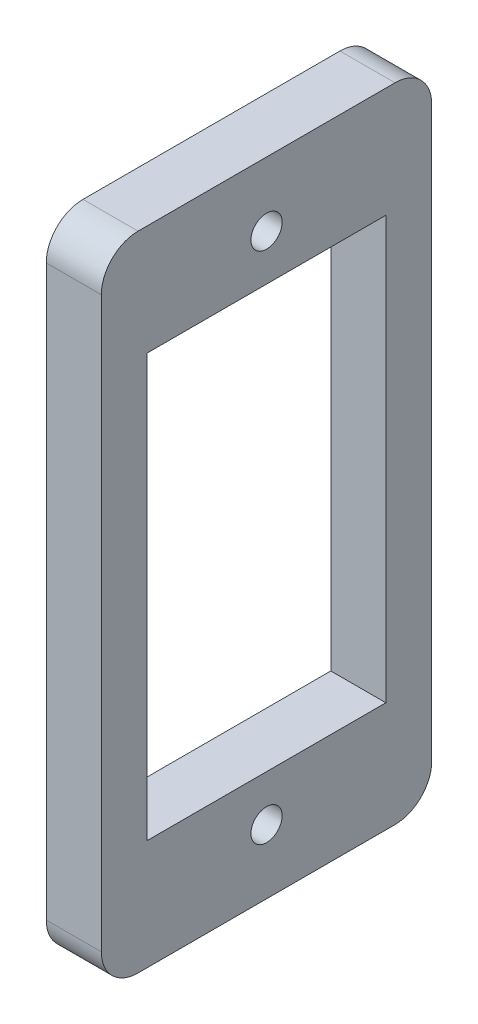
ISO-10303-21;
HEADER;
FILE_DESCRIPTION(('STEP AP214'),'2;1');
FILE_NAME('part.step','',(''),(''),'','','');
FILE_SCHEMA(('AUTOMOTIVE_DESIGN { 1 0 10303 214 1 1 1 1 }'));
ENDSEC;
DATA;
#1=APPLICATION_CONTEXT('core data for automotive mechanical design processes');
#2=APPLICATION_PROTOCOL_DEFINITION('international standard','automotive_design',2000,#1);
#3=PRODUCT_CONTEXT('',#1,'mechanical');
#4=PRODUCT('Part','Part','',(#3));
#5=PRODUCT_RELATED_PRODUCT_CATEGORY('part','',(#4));
#6=PRODUCT_DEFINITION_FORMATION('','',#4);
#7=PRODUCT_DEFINITION_CONTEXT('part definition',#1,'design');
#8=PRODUCT_DEFINITION('design','',#6,#7);
#9=PRODUCT_DEFINITION_SHAPE('','',#8);
#10=(LENGTH_UNIT() NAMED_UNIT(*) SI_UNIT(.MILLI.,.METRE.));
#11=(NAMED_UNIT(*) PLANE_ANGLE_UNIT() SI_UNIT($,.RADIAN.));
#12=(NAMED_UNIT(*) SI_UNIT($,.STERADIAN.) SOLID_ANGLE_UNIT());
#13=UNCERTAINTY_MEASURE_WITH_UNIT(LENGTH_MEASURE(1.E-05),#10,'distance_accuracy_value','');
#14=(GEOMETRIC_REPRESENTATION_CONTEXT(3) GLOBAL_UNCERTAINTY_ASSIGNED_CONTEXT((#13)) GLOBAL_UNIT_ASSIGNED_CONTEXT((#10,
#11,#12)) REPRESENTATION_CONTEXT('',''));
#15=CARTESIAN_POINT('',(0.,0.,0.));
#16=DIRECTION('',(0.,0.,1.));
#17=DIRECTION('',(1.,0.,0.));
#18=AXIS2_PLACEMENT_3D('',#15,#16,#17);
#19=CARTESIAN_POINT('',(3.,-17.5,-9.));
#20=DIRECTION('',(0.,0.,1.));
#21=DIRECTION('',(1.,0.,0.));
#22=AXIS2_PLACEMENT_3D('',#19,#20,#21);
#23=PLANE('',#22);
#24=DIRECTION('',(0.,1.,0.));
#25=VECTOR('',#24,1.);
#26=CARTESIAN_POINT('',(3.,-17.5,-9.));
#27=LINE('',#26,#25);
#28=CARTESIAN_POINT('',(3.,-15.5,-9.));
#29=VERTEX_POINT('',#28);
#30=CARTESIAN_POINT('',(3.,15.5,-9.));
#31=VERTEX_POINT('',#30);
#32=EDGE_CURVE('E165',#29,#31,#27,.T.);
#33=ORIENTED_EDGE('',*,*,#32,.F.);
#34=DIRECTION('',(-1.,0.,0.));
#35=VECTOR('',#34,1.);
#36=CARTESIAN_POINT('',(3.,-15.5,-9.));
#37=LINE('',#36,#35);
#38=CARTESIAN_POINT('',(0.,-15.5,-9.));
#39=VERTEX_POINT('',#38);
#40=EDGE_CURVE('E212',#29,#39,#37,.T.);
#41=ORIENTED_EDGE('',*,*,#40,.T.);
#42=DIRECTION('',(0.,1.,0.));
#43=VECTOR('',#42,1.);
#44=CARTESIAN_POINT('',(0.,-17.5,-9.));
#45=LINE('',#44,#43);
#46=CARTESIAN_POINT('',(0.,15.5,-9.));
#47=VERTEX_POINT('',#46);
#48=EDGE_CURVE('E133',#39,#47,#45,.T.);
#49=ORIENTED_EDGE('',*,*,#48,.T.);
#50=DIRECTION('',(-1.,0.,0.));
#51=VECTOR('',#50,1.);
#52=CARTESIAN_POINT('',(3.,15.5,-9.));
#53=LINE('',#52,#51);
#54=EDGE_CURVE('E210',#47,#31,#53,.F.);
#55=ORIENTED_EDGE('',*,*,#54,.T.);
#56=EDGE_LOOP('',(#33,#41,#49,#55));
#57=FACE_BOUND('',#56,.T.);
#58=ADVANCED_FACE('F33',(#57),#23,.F.);
#59=CARTESIAN_POINT('',(3.,17.5,9.));
#60=DIRECTION('',(0.,-1.,0.));
#61=DIRECTION('',(0.,0.,-1.));
#62=AXIS2_PLACEMENT_3D('',#59,#60,#61);
#63=PLANE('',#62);
#64=DIRECTION('',(0.,0.,1.));
#65=VECTOR('',#64,1.);
#66=CARTESIAN_POINT('',(0.,17.5,9.));
#67=LINE('',#66,#65);
#68=CARTESIAN_POINT('',(0.,17.5,-7.));
#69=VERTEX_POINT('',#68);
#70=CARTESIAN_POINT('',(0.,17.5,7.));
#71=VERTEX_POINT('',#70);
#72=EDGE_CURVE('E179',#69,#71,#67,.T.);
#73=ORIENTED_EDGE('',*,*,#72,.T.);
#74=DIRECTION('',(-1.,0.,0.));
#75=VECTOR('',#74,1.);
#76=CARTESIAN_POINT('',(3.,17.5,7.));
#77=LINE('',#76,#75);
#78=CARTESIAN_POINT('',(3.,17.5,7.));
#79=VERTEX_POINT('',#78);
#80=EDGE_CURVE('E11',#71,#79,#77,.F.);
#81=ORIENTED_EDGE('',*,*,#80,.T.);
#82=DIRECTION('',(0.,0.,1.));
#83=VECTOR('',#82,1.);
#84=CARTESIAN_POINT('',(3.,17.5,9.));
#85=LINE('',#84,#83);
#86=CARTESIAN_POINT('',(3.,17.5,-7.));
#87=VERTEX_POINT('',#86);
#88=EDGE_CURVE('E167',#87,#79,#85,.T.);
#89=ORIENTED_EDGE('',*,*,#88,.F.);
#90=DIRECTION('',(-1.,0.,0.));
#91=VECTOR('',#90,1.);
#92=CARTESIAN_POINT('',(3.,17.5,-7.));
#93=LINE('',#92,#91);
#94=EDGE_CURVE('E41',#87,#69,#93,.T.);
#95=ORIENTED_EDGE('',*,*,#94,.T.);
#96=EDGE_LOOP('',(#73,#81,#89,#95));
#97=FACE_BOUND('',#96,.T.);
#98=ADVANCED_FACE('F217',(#97),#63,.F.);
#99=CARTESIAN_POINT('',(3.,-17.5,9.));
#100=DIRECTION('',(0.,0.,-1.));
#101=DIRECTION('',(-1.,0.,0.));
#102=AXIS2_PLACEMENT_3D('',#99,#100,#101);
#103=PLANE('',#102);
#104=DIRECTION('',(0.,-1.,0.));
#105=VECTOR('',#104,1.);
#106=CARTESIAN_POINT('',(0.,-17.5,9.));
#107=LINE('',#106,#105);
#108=CARTESIAN_POINT('',(0.,15.5,9.));
#109=VERTEX_POINT('',#108);
#110=CARTESIAN_POINT('',(0.,-15.5,9.));
#111=VERTEX_POINT('',#110);
#112=EDGE_CURVE('E181',#109,#111,#107,.T.);
#113=ORIENTED_EDGE('',*,*,#112,.T.);
#114=DIRECTION('',(-1.,0.,0.));
#115=VECTOR('',#114,1.);
#116=CARTESIAN_POINT('',(3.,-15.5,9.));
#117=LINE('',#116,#115);
#118=CARTESIAN_POINT('',(3.,-15.5,9.));
#119=VERTEX_POINT('',#118);
#120=EDGE_CURVE('E201',#111,#119,#117,.F.);
#121=ORIENTED_EDGE('',*,*,#120,.T.);
#122=DIRECTION('',(0.,-1.,0.));
#123=VECTOR('',#122,1.);
#124=CARTESIAN_POINT('',(3.,-17.5,9.));
#125=LINE('',#124,#123);
#126=CARTESIAN_POINT('',(3.,15.5,9.));
#127=VERTEX_POINT('',#126);
#128=EDGE_CURVE('E170',#127,#119,#125,.T.);
#129=ORIENTED_EDGE('',*,*,#128,.F.);
#130=DIRECTION('',(-1.,0.,0.));
#131=VECTOR('',#130,1.);
#132=CARTESIAN_POINT('',(3.,15.5,9.));
#133=LINE('',#132,#131);
#134=EDGE_CURVE('E198',#127,#109,#133,.T.);
#135=ORIENTED_EDGE('',*,*,#134,.T.);
#136=EDGE_LOOP('',(#113,#121,#129,#135));
#137=FACE_BOUND('',#136,.T.);
#138=ADVANCED_FACE('F228',(#137),#103,.F.);
#139=CARTESIAN_POINT('',(3.,-17.5,9.));
#140=DIRECTION('',(0.,1.,0.));
#141=DIRECTION('',(0.,0.,1.));
#142=AXIS2_PLACEMENT_3D('',#139,#140,#141);
#143=PLANE('',#142);
#144=DIRECTION('',(0.,0.,-1.));
#145=VECTOR('',#144,1.);
#146=CARTESIAN_POINT('',(3.,-17.5,9.));
#147=LINE('',#146,#145);
#148=CARTESIAN_POINT('',(3.,-17.5,7.));
#149=VERTEX_POINT('',#148);
#150=CARTESIAN_POINT('',(3.,-17.5,-7.));
#151=VERTEX_POINT('',#150);
#152=EDGE_CURVE('E173',#149,#151,#147,.T.);
#153=ORIENTED_EDGE('',*,*,#152,.F.);
#154=DIRECTION('',(-1.,0.,0.));
#155=VECTOR('',#154,1.);
#156=CARTESIAN_POINT('',(3.,-17.5,7.));
#157=LINE('',#156,#155);
#158=CARTESIAN_POINT('',(0.,-17.5,7.));
#159=VERTEX_POINT('',#158);
#160=EDGE_CURVE('E187',#149,#159,#157,.T.);
#161=ORIENTED_EDGE('',*,*,#160,.T.);
#162=DIRECTION('',(0.,0.,-1.));
#163=VECTOR('',#162,1.);
#164=CARTESIAN_POINT('',(0.,-17.5,9.));
#165=LINE('',#164,#163);
#166=CARTESIAN_POINT('',(0.,-17.5,-7.));
#167=VERTEX_POINT('',#166);
#168=EDGE_CURVE('E168',#159,#167,#165,.T.);
#169=ORIENTED_EDGE('',*,*,#168,.T.);
#170=DIRECTION('',(-1.,0.,0.));
#171=VECTOR('',#170,1.);
#172=CARTESIAN_POINT('',(3.,-17.5,-7.));
#173=LINE('',#172,#171);
#174=EDGE_CURVE('E176',#167,#151,#173,.F.);
#175=ORIENTED_EDGE('',*,*,#174,.T.);
#176=EDGE_LOOP('',(#153,#161,#169,#175));
#177=FACE_BOUND('',#176,.T.);
#178=ADVANCED_FACE('F237',(#177),#143,.F.);
#179=CARTESIAN_POINT('',(3.,0.,0.));
#180=DIRECTION('',(-1.,0.,0.));
#181=DIRECTION('',(0.,0.,1.));
#182=AXIS2_PLACEMENT_3D('',#179,#180,#181);
#183=PLANE('',#182);
#184=CARTESIAN_POINT('',(3.,-14.,0.));
#185=DIRECTION('',(-1.,0.,0.));
#186=DIRECTION('',(0.,0.,1.));
#187=AXIS2_PLACEMENT_3D('',#184,#185,#186);
#188=CIRCLE('',#187,0.85);
#189=CARTESIAN_POINT('',(3.,-14.,0.85));
#190=VERTEX_POINT('',#189);
#191=EDGE_CURVE('E385',#190,#190,#188,.F.);
#192=ORIENTED_EDGE('',*,*,#191,.F.);
#193=EDGE_LOOP('',(#192));
#194=FACE_BOUND('',#193,.T.);
#195=CARTESIAN_POINT('',(3.,14.,0.));
#196=DIRECTION('',(-1.,0.,0.));
#197=DIRECTION('',(0.,0.,1.));
#198=AXIS2_PLACEMENT_3D('',#195,#196,#197);
#199=CIRCLE('',#198,0.85);
#200=CARTESIAN_POINT('',(3.,14.,0.85));
#201=VERTEX_POINT('',#200);
#202=EDGE_CURVE('E389',#201,#201,#199,.F.);
#203=ORIENTED_EDGE('',*,*,#202,.F.);
#204=EDGE_LOOP('',(#203));
#205=FACE_BOUND('',#204,.T.);
#206=DIRECTION('',(0.,0.,-1.));
#207=VECTOR('',#206,1.);
#208=CARTESIAN_POINT('',(3.,-11.5,-6.5));
#209=LINE('',#208,#207);
#210=CARTESIAN_POINT('',(3.,-11.5,6.5));
#211=VERTEX_POINT('',#210);
#212=CARTESIAN_POINT('',(3.,-11.5,-6.5));
#213=VERTEX_POINT('',#212);
#214=EDGE_CURVE('E149',#211,#213,#209,.T.);
#215=ORIENTED_EDGE('',*,*,#214,.F.);
#216=DIRECTION('',(0.,-1.,0.));
#217=VECTOR('',#216,1.);
#218=CARTESIAN_POINT('',(3.,-11.5,6.5));
#219=LINE('',#218,#217);
#220=CARTESIAN_POINT('',(3.,11.5,6.5));
#221=VERTEX_POINT('',#220);
#222=EDGE_CURVE('E141',#221,#211,#219,.T.);
#223=ORIENTED_EDGE('',*,*,#222,.F.);
#224=DIRECTION('',(0.,0.,1.));
#225=VECTOR('',#224,1.);
#226=CARTESIAN_POINT('',(3.,11.5,-6.5));
#227=LINE('',#226,#225);
#228=CARTESIAN_POINT('',(3.,11.5,-6.5));
#229=VERTEX_POINT('',#228);
#230=EDGE_CURVE('E142',#229,#221,#227,.T.);
#231=ORIENTED_EDGE('',*,*,#230,.F.);
#232=DIRECTION('',(0.,1.,0.));
#233=VECTOR('',#232,1.);
#234=CARTESIAN_POINT('',(3.,-11.5,-6.5));
#235=LINE('',#234,#233);
#236=EDGE_CURVE('E156',#213,#229,#235,.T.);
#237=ORIENTED_EDGE('',*,*,#236,.F.);
#238=EDGE_LOOP('',(#215,#223,#231,#237));
#239=FACE_BOUND('',#238,.T.);
#240=ORIENTED_EDGE('',*,*,#128,.T.);
#241=CARTESIAN_POINT('',(3.,-15.5,7.));
#242=DIRECTION('',(-1.,0.,0.));
#243=DIRECTION('',(0.,0.,1.));
#244=AXIS2_PLACEMENT_3D('',#241,#242,#243);
#245=CIRCLE('',#244,2.);
#246=EDGE_CURVE('E208',#119,#149,#245,.F.);
#247=ORIENTED_EDGE('',*,*,#246,.T.);
#248=ORIENTED_EDGE('',*,*,#152,.T.);
#249=CARTESIAN_POINT('',(3.,-15.5,-7.));
#250=DIRECTION('',(-1.,0.,0.));
#251=DIRECTION('',(0.,0.,1.));
#252=AXIS2_PLACEMENT_3D('',#249,#250,#251);
#253=CIRCLE('',#252,2.);
#254=EDGE_CURVE('E206',#151,#29,#253,.F.);
#255=ORIENTED_EDGE('',*,*,#254,.T.);
#256=ORIENTED_EDGE('',*,*,#32,.T.);
#257=CARTESIAN_POINT('',(3.,15.5,-7.));
#258=DIRECTION('',(-1.,0.,0.));
#259=DIRECTION('',(0.,0.,1.));
#260=AXIS2_PLACEMENT_3D('',#257,#258,#259);
#261=CIRCLE('',#260,2.);
#262=EDGE_CURVE('E53',#31,#87,#261,.F.);
#263=ORIENTED_EDGE('',*,*,#262,.T.);
#264=ORIENTED_EDGE('',*,*,#88,.T.);
#265=CARTESIAN_POINT('',(3.,15.5,7.));
#266=DIRECTION('',(-1.,0.,0.));
#267=DIRECTION('',(0.,0.,1.));
#268=AXIS2_PLACEMENT_3D('',#265,#266,#267);
#269=CIRCLE('',#268,2.);
#270=EDGE_CURVE('E204',#79,#127,#269,.F.);
#271=ORIENTED_EDGE('',*,*,#270,.T.);
#272=EDGE_LOOP('',(#240,#247,#248,#255,#256,#263,#264,#271));
#273=FACE_BOUND('',#272,.T.);
#274=ADVANCED_FACE('F231',(#194,#205,#239,#273),#183,.F.);
#275=CARTESIAN_POINT('',(0.,0.,0.));
#276=DIRECTION('',(-1.,0.,0.));
#277=DIRECTION('',(0.,0.,1.));
#278=AXIS2_PLACEMENT_3D('',#275,#276,#277);
#279=PLANE('',#278);
#280=CARTESIAN_POINT('',(0.,-14.,0.));
#281=DIRECTION('',(-1.,0.,0.));
#282=DIRECTION('',(0.,0.,1.));
#283=AXIS2_PLACEMENT_3D('',#280,#281,#282);
#284=CIRCLE('',#283,0.85);
#285=CARTESIAN_POINT('',(0.,-14.,0.85));
#286=VERTEX_POINT('',#285);
#287=EDGE_CURVE('E399',#286,#286,#284,.T.);
#288=ORIENTED_EDGE('',*,*,#287,.F.);
#289=EDGE_LOOP('',(#288));
#290=FACE_BOUND('',#289,.T.);
#291=CARTESIAN_POINT('',(0.,14.,0.));
#292=DIRECTION('',(-1.,0.,0.));
#293=DIRECTION('',(0.,0.,1.));
#294=AXIS2_PLACEMENT_3D('',#291,#292,#293);
#295=CIRCLE('',#294,0.85);
#296=CARTESIAN_POINT('',(0.,14.,0.85));
#297=VERTEX_POINT('',#296);
#298=EDGE_CURVE('E393',#297,#297,#295,.T.);
#299=ORIENTED_EDGE('',*,*,#298,.F.);
#300=EDGE_LOOP('',(#299));
#301=FACE_BOUND('',#300,.T.);
#302=DIRECTION('',(0.,-1.,0.));
#303=VECTOR('',#302,1.);
#304=CARTESIAN_POINT('',(0.,-11.5,6.5));
#305=LINE('',#304,#303);
#306=CARTESIAN_POINT('',(0.,11.5,6.5));
#307=VERTEX_POINT('',#306);
#308=CARTESIAN_POINT('',(0.,-11.5,6.5));
#309=VERTEX_POINT('',#308);
#310=EDGE_CURVE('E138',#307,#309,#305,.T.);
#311=ORIENTED_EDGE('',*,*,#310,.T.);
#312=DIRECTION('',(0.,0.,-1.));
#313=VECTOR('',#312,1.);
#314=CARTESIAN_POINT('',(0.,-11.5,-6.5));
#315=LINE('',#314,#313);
#316=CARTESIAN_POINT('',(0.,-11.5,-6.5));
#317=VERTEX_POINT('',#316);
#318=EDGE_CURVE('E122',#309,#317,#315,.T.);
#319=ORIENTED_EDGE('',*,*,#318,.T.);
#320=DIRECTION('',(0.,1.,0.));
#321=VECTOR('',#320,1.);
#322=CARTESIAN_POINT('',(0.,-11.5,-6.5));
#323=LINE('',#322,#321);
#324=CARTESIAN_POINT('',(0.,11.5,-6.5));
#325=VERTEX_POINT('',#324);
#326=EDGE_CURVE('E151',#317,#325,#323,.T.);
#327=ORIENTED_EDGE('',*,*,#326,.T.);
#328=DIRECTION('',(0.,0.,1.));
#329=VECTOR('',#328,1.);
#330=CARTESIAN_POINT('',(0.,11.5,-6.5));
#331=LINE('',#330,#329);
#332=EDGE_CURVE('E147',#325,#307,#331,.T.);
#333=ORIENTED_EDGE('',*,*,#332,.T.);
#334=EDGE_LOOP('',(#311,#319,#327,#333));
#335=FACE_BOUND('',#334,.T.);
#336=ORIENTED_EDGE('',*,*,#168,.F.);
#337=CARTESIAN_POINT('',(0.,-15.5,7.));
#338=DIRECTION('',(-1.,0.,0.));
#339=DIRECTION('',(0.,0.,1.));
#340=AXIS2_PLACEMENT_3D('',#337,#338,#339);
#341=CIRCLE('',#340,2.);
#342=EDGE_CURVE('E196',#159,#111,#341,.T.);
#343=ORIENTED_EDGE('',*,*,#342,.T.);
#344=ORIENTED_EDGE('',*,*,#112,.F.);
#345=CARTESIAN_POINT('',(0.,15.5,7.));
#346=DIRECTION('',(-1.,0.,0.));
#347=DIRECTION('',(0.,0.,1.));
#348=AXIS2_PLACEMENT_3D('',#345,#346,#347);
#349=CIRCLE('',#348,2.);
#350=EDGE_CURVE('E192',#109,#71,#349,.T.);
#351=ORIENTED_EDGE('',*,*,#350,.T.);
#352=ORIENTED_EDGE('',*,*,#72,.F.);
#353=CARTESIAN_POINT('',(0.,15.5,-7.));
#354=DIRECTION('',(-1.,0.,0.));
#355=DIRECTION('',(0.,0.,1.));
#356=AXIS2_PLACEMENT_3D('',#353,#354,#355);
#357=CIRCLE('',#356,2.);
#358=EDGE_CURVE('E190',#69,#47,#357,.T.);
#359=ORIENTED_EDGE('',*,*,#358,.T.);
#360=ORIENTED_EDGE('',*,*,#48,.F.);
#361=CARTESIAN_POINT('',(0.,-15.5,-7.));
#362=DIRECTION('',(-1.,0.,0.));
#363=DIRECTION('',(0.,0.,1.));
#364=AXIS2_PLACEMENT_3D('',#361,#362,#363);
#365=CIRCLE('',#364,2.);
#366=EDGE_CURVE('E194',#39,#167,#365,.T.);
#367=ORIENTED_EDGE('',*,*,#366,.T.);
#368=EDGE_LOOP('',(#336,#343,#344,#351,#352,#359,#360,#367));
#369=FACE_BOUND('',#368,.T.);
#370=ADVANCED_FACE('F145',(#290,#301,#335,#369),#279,.T.);
#371=CARTESIAN_POINT('',(-0.00100000000000013,-11.5,6.5));
#372=DIRECTION('',(0.,0.,1.));
#373=DIRECTION('',(1.,0.,0.));
#374=AXIS2_PLACEMENT_3D('',#371,#372,#373);
#375=PLANE('',#374);
#376=DIRECTION('',(1.,0.,0.));
#377=VECTOR('',#376,1.);
#378=CARTESIAN_POINT('',(-0.00100000000000013,11.5,6.5));
#379=LINE('',#378,#377);
#380=EDGE_CURVE('E134',#307,#221,#379,.T.);
#381=ORIENTED_EDGE('',*,*,#380,.T.);
#382=ORIENTED_EDGE('',*,*,#222,.T.);
#383=DIRECTION('',(1.,0.,0.));
#384=VECTOR('',#383,1.);
#385=CARTESIAN_POINT('',(-0.00100000000000013,-11.5,6.5));
#386=LINE('',#385,#384);
#387=EDGE_CURVE('E126',#309,#211,#386,.T.);
#388=ORIENTED_EDGE('',*,*,#387,.F.);
#389=ORIENTED_EDGE('',*,*,#310,.F.);
#390=EDGE_LOOP('',(#381,#382,#388,#389));
#391=FACE_BOUND('',#390,.T.);
#392=ADVANCED_FACE('F137',(#391),#375,.F.);
#393=CARTESIAN_POINT('',(-0.00100000000000013,11.5,-6.5));
#394=DIRECTION('',(0.,1.,0.));
#395=DIRECTION('',(0.,0.,1.));
#396=AXIS2_PLACEMENT_3D('',#393,#394,#395);
#397=PLANE('',#396);
#398=DIRECTION('',(1.,0.,0.));
#399=VECTOR('',#398,1.);
#400=CARTESIAN_POINT('',(-0.00100000000000013,11.5,-6.5));
#401=LINE('',#400,#399);
#402=EDGE_CURVE('E162',#325,#229,#401,.T.);
#403=ORIENTED_EDGE('',*,*,#402,.T.);
#404=ORIENTED_EDGE('',*,*,#230,.T.);
#405=ORIENTED_EDGE('',*,*,#380,.F.);
#406=ORIENTED_EDGE('',*,*,#332,.F.);
#407=EDGE_LOOP('',(#403,#404,#405,#406));
#408=FACE_BOUND('',#407,.T.);
#409=ADVANCED_FACE('F316',(#408),#397,.F.);
#410=CARTESIAN_POINT('',(-0.00100000000000013,-11.5,-6.5));
#411=DIRECTION('',(0.,0.,-1.));
#412=DIRECTION('',(-1.,0.,0.));
#413=AXIS2_PLACEMENT_3D('',#410,#411,#412);
#414=PLANE('',#413);
#415=DIRECTION('',(1.,0.,0.));
#416=VECTOR('',#415,1.);
#417=CARTESIAN_POINT('',(-0.00100000000000013,-11.5,-6.5));
#418=LINE('',#417,#416);
#419=EDGE_CURVE('E128',#317,#213,#418,.T.);
#420=ORIENTED_EDGE('',*,*,#419,.T.);
#421=ORIENTED_EDGE('',*,*,#236,.T.);
#422=ORIENTED_EDGE('',*,*,#402,.F.);
#423=ORIENTED_EDGE('',*,*,#326,.F.);
#424=EDGE_LOOP('',(#420,#421,#422,#423));
#425=FACE_BOUND('',#424,.T.);
#426=ADVANCED_FACE('F308',(#425),#414,.F.);
#427=CARTESIAN_POINT('',(-0.00100000000000013,-11.5,-6.5));
#428=DIRECTION('',(0.,-1.,0.));
#429=DIRECTION('',(0.,0.,-1.));
#430=AXIS2_PLACEMENT_3D('',#427,#428,#429);
#431=PLANE('',#430);
#432=ORIENTED_EDGE('',*,*,#387,.T.);
#433=ORIENTED_EDGE('',*,*,#214,.T.);
#434=ORIENTED_EDGE('',*,*,#419,.F.);
#435=ORIENTED_EDGE('',*,*,#318,.F.);
#436=EDGE_LOOP('',(#432,#433,#434,#435));
#437=FACE_BOUND('',#436,.T.);
#438=ADVANCED_FACE('F124',(#437),#431,.F.);
#439=CARTESIAN_POINT('',(3.001,14.,0.));
#440=DIRECTION('',(-1.,0.,0.));
#441=DIRECTION('',(0.,0.,1.));
#442=AXIS2_PLACEMENT_3D('',#439,#440,#441);
#443=CYLINDRICAL_SURFACE('',#442,0.85);
#444=CARTESIAN_POINT('',(0.,14.,0.85));
#445=CARTESIAN_POINT('',(0.0312500000000005,14.,0.85));
#446=CARTESIAN_POINT('',(0.0625000000000005,14.,0.85));
#447=CARTESIAN_POINT('',(0.125000000000001,14.,0.85));
#448=CARTESIAN_POINT('',(0.156250000000001,14.,0.85));
#449=CARTESIAN_POINT('',(0.218750000000001,14.,0.85));
#450=CARTESIAN_POINT('',(0.250000000000001,14.,0.85));
#451=CARTESIAN_POINT('',(0.312500000000001,14.,0.85));
#452=CARTESIAN_POINT('',(0.34375,14.,0.85));
#453=CARTESIAN_POINT('',(0.40625,14.,0.85));
#454=CARTESIAN_POINT('',(0.4375,14.,0.85));
#455=CARTESIAN_POINT('',(0.5,14.,0.85));
#456=CARTESIAN_POINT('',(0.53125,14.,0.85));
#457=CARTESIAN_POINT('',(0.593750000000001,14.,0.85));
#458=CARTESIAN_POINT('',(0.625000000000001,14.,0.85));
#459=CARTESIAN_POINT('',(0.687500000000001,14.,0.85));
#460=CARTESIAN_POINT('',(0.71875,14.,0.85));
#461=CARTESIAN_POINT('',(0.78125,14.,0.85));
#462=CARTESIAN_POINT('',(0.8125,14.,0.85));
#463=CARTESIAN_POINT('',(0.875,14.,0.85));
#464=CARTESIAN_POINT('',(0.90625,14.,0.85));
#465=CARTESIAN_POINT('',(0.96875,14.,0.85));
#466=CARTESIAN_POINT('',(1.,14.,0.85));
#467=CARTESIAN_POINT('',(1.0625,14.,0.85));
#468=CARTESIAN_POINT('',(1.09375,14.,0.85));
#469=CARTESIAN_POINT('',(1.15625,14.,0.85));
#470=CARTESIAN_POINT('',(1.1875,14.,0.85));
#471=CARTESIAN_POINT('',(1.25,14.,0.85));
#472=CARTESIAN_POINT('',(1.28125,14.,0.85));
#473=CARTESIAN_POINT('',(1.34375,14.,0.85));
#474=CARTESIAN_POINT('',(1.375,14.,0.85));
#475=CARTESIAN_POINT('',(1.4375,14.,0.85));
#476=CARTESIAN_POINT('',(1.46875,14.,0.85));
#477=CARTESIAN_POINT('',(1.53125,14.,0.85));
#478=CARTESIAN_POINT('',(1.5625,14.,0.85));
#479=CARTESIAN_POINT('',(1.625,14.,0.85));
#480=CARTESIAN_POINT('',(1.65625,14.,0.85));
#481=CARTESIAN_POINT('',(1.71875,14.,0.85));
#482=CARTESIAN_POINT('',(1.75,14.,0.85));
#483=CARTESIAN_POINT('',(1.8125,14.,0.85));
#484=CARTESIAN_POINT('',(1.84375,14.,0.85));
#485=CARTESIAN_POINT('',(1.90625,14.,0.85));
#486=CARTESIAN_POINT('',(1.9375,14.,0.85));
#487=CARTESIAN_POINT('',(2.,14.,0.85));
#488=CARTESIAN_POINT('',(2.03125,14.,0.85));
#489=CARTESIAN_POINT('',(2.09375,14.,0.85));
#490=CARTESIAN_POINT('',(2.125,14.,0.85));
#491=CARTESIAN_POINT('',(2.1875,14.,0.85));
#492=CARTESIAN_POINT('',(2.21875,14.,0.85));
#493=CARTESIAN_POINT('',(2.28125,14.,0.85));
#494=CARTESIAN_POINT('',(2.3125,14.,0.85));
#495=CARTESIAN_POINT('',(2.375,14.,0.85));
#496=CARTESIAN_POINT('',(2.40625,14.,0.85));
#497=CARTESIAN_POINT('',(2.46875,14.,0.85));
#498=CARTESIAN_POINT('',(2.5,14.,0.85));
#499=CARTESIAN_POINT('',(2.5625,14.,0.85));
#500=CARTESIAN_POINT('',(2.59375,14.,0.85));
#501=CARTESIAN_POINT('',(2.65625,14.,0.85));
#502=CARTESIAN_POINT('',(2.6875,14.,0.85));
#503=CARTESIAN_POINT('',(2.75,14.,0.85));
#504=CARTESIAN_POINT('',(2.78125,14.,0.85));
#505=CARTESIAN_POINT('',(2.84375,14.,0.85));
#506=CARTESIAN_POINT('',(2.875,14.,0.85));
#507=CARTESIAN_POINT('',(2.9375,14.,0.85));
#508=CARTESIAN_POINT('',(2.96875,14.,0.85));
#509=CARTESIAN_POINT('',(3.,14.,0.85));
#510=B_SPLINE_CURVE_WITH_KNOTS('',3,(#444,#445,#446,#447,#448,#449,#450,#451,#452,#453,#454,
#455,#456,#457,#458,#459,#460,#461,#462,#463,#464,#465,#466,#467,#468,#469,#470,#471,#472,#473,
#474,#475,#476,#477,#478,#479,#480,#481,#482,#483,#484,#485,#486,#487,#488,#489,#490,#491,#492,
#493,#494,#495,#496,#497,#498,#499,#500,#501,#502,#503,#504,#505,#506,#507,#508,#509),
.UNSPECIFIED.,.F.,.F.,(4,2,2,2,2,2,2,2,2,2,2,2,2,2,2,2,2,2,2,2,2,2,2,2,2,2,2,2,2,2,2,2,4),(0.,
0.0937500000000001,0.1875,0.28125,0.375,0.46875,0.5625,0.65625,0.75,0.84375,0.9375,1.03125,
1.125,1.21875,1.3125,1.40625,1.5,1.59375,1.6875,1.78125,1.875,1.96875,2.0625,2.15625,2.25,
2.34375,2.4375,2.53125,2.625,2.71875,2.8125,2.90625,3.),.UNSPECIFIED.);
#511=EDGE_CURVE('BSEAM291',#297,#201,#510,.T.);
#512=ORIENTED_EDGE('',*,*,#298,.T.);
#513=ORIENTED_EDGE('',*,*,#202,.T.);
#514=ORIENTED_EDGE('',*,*,#511,.T.);
#515=ORIENTED_EDGE('',*,*,#511,.F.);
#516=EDGE_LOOP('',(#512,#514,#513,#515));
#517=FACE_BOUND('',#516,.T.);
#518=ADVANCED_FACE('F291',(#517),#443,.F.);
#519=CARTESIAN_POINT('',(3.001,-14.,0.));
#520=DIRECTION('',(-1.,0.,0.));
#521=DIRECTION('',(0.,0.,1.));
#522=AXIS2_PLACEMENT_3D('',#519,#520,#521);
#523=CYLINDRICAL_SURFACE('',#522,0.85);
#524=CARTESIAN_POINT('',(0.,-14.,0.85));
#525=CARTESIAN_POINT('',(0.0312500000000005,-14.,0.85));
#526=CARTESIAN_POINT('',(0.0625000000000005,-14.,0.85));
#527=CARTESIAN_POINT('',(0.125000000000001,-14.,0.85));
#528=CARTESIAN_POINT('',(0.156250000000001,-14.,0.85));
#529=CARTESIAN_POINT('',(0.218750000000001,-14.,0.85));
#530=CARTESIAN_POINT('',(0.250000000000001,-14.,0.85));
#531=CARTESIAN_POINT('',(0.312500000000001,-14.,0.85));
#532=CARTESIAN_POINT('',(0.34375,-14.,0.85));
#533=CARTESIAN_POINT('',(0.40625,-14.,0.85));
#534=CARTESIAN_POINT('',(0.4375,-14.,0.85));
#535=CARTESIAN_POINT('',(0.5,-14.,0.85));
#536=CARTESIAN_POINT('',(0.53125,-14.,0.85));
#537=CARTESIAN_POINT('',(0.593750000000001,-14.,0.85));
#538=CARTESIAN_POINT('',(0.625000000000001,-14.,0.85));
#539=CARTESIAN_POINT('',(0.687500000000001,-14.,0.85));
#540=CARTESIAN_POINT('',(0.71875,-14.,0.85));
#541=CARTESIAN_POINT('',(0.78125,-14.,0.85));
#542=CARTESIAN_POINT('',(0.8125,-14.,0.85));
#543=CARTESIAN_POINT('',(0.875,-14.,0.85));
#544=CARTESIAN_POINT('',(0.90625,-14.,0.85));
#545=CARTESIAN_POINT('',(0.96875,-14.,0.85));
#546=CARTESIAN_POINT('',(1.,-14.,0.85));
#547=CARTESIAN_POINT('',(1.0625,-14.,0.85));
#548=CARTESIAN_POINT('',(1.09375,-14.,0.85));
#549=CARTESIAN_POINT('',(1.15625,-14.,0.85));
#550=CARTESIAN_POINT('',(1.1875,-14.,0.85));
#551=CARTESIAN_POINT('',(1.25,-14.,0.85));
#552=CARTESIAN_POINT('',(1.28125,-14.,0.85));
#553=CARTESIAN_POINT('',(1.34375,-14.,0.85));
#554=CARTESIAN_POINT('',(1.375,-14.,0.85));
#555=CARTESIAN_POINT('',(1.4375,-14.,0.85));
#556=CARTESIAN_POINT('',(1.46875,-14.,0.85));
#557=CARTESIAN_POINT('',(1.53125,-14.,0.85));
#558=CARTESIAN_POINT('',(1.5625,-14.,0.85));
#559=CARTESIAN_POINT('',(1.625,-14.,0.85));
#560=CARTESIAN_POINT('',(1.65625,-14.,0.85));
#561=CARTESIAN_POINT('',(1.71875,-14.,0.85));
#562=CARTESIAN_POINT('',(1.75,-14.,0.85));
#563=CARTESIAN_POINT('',(1.8125,-14.,0.85));
#564=CARTESIAN_POINT('',(1.84375,-14.,0.85));
#565=CARTESIAN_POINT('',(1.90625,-14.,0.85));
#566=CARTESIAN_POINT('',(1.9375,-14.,0.85));
#567=CARTESIAN_POINT('',(2.,-14.,0.85));
#568=CARTESIAN_POINT('',(2.03125,-14.,0.85));
#569=CARTESIAN_POINT('',(2.09375,-14.,0.85));
#570=CARTESIAN_POINT('',(2.125,-14.,0.85));
#571=CARTESIAN_POINT('',(2.1875,-14.,0.85));
#572=CARTESIAN_POINT('',(2.21875,-14.,0.85));
#573=CARTESIAN_POINT('',(2.28125,-14.,0.85));
#574=CARTESIAN_POINT('',(2.3125,-14.,0.85));
#575=CARTESIAN_POINT('',(2.375,-14.,0.85));
#576=CARTESIAN_POINT('',(2.40625,-14.,0.85));
#577=CARTESIAN_POINT('',(2.46875,-14.,0.85));
#578=CARTESIAN_POINT('',(2.5,-14.,0.85));
#579=CARTESIAN_POINT('',(2.5625,-14.,0.85));
#580=CARTESIAN_POINT('',(2.59375,-14.,0.85));
#581=CARTESIAN_POINT('',(2.65625,-14.,0.85));
#582=CARTESIAN_POINT('',(2.6875,-14.,0.85));
#583=CARTESIAN_POINT('',(2.75,-14.,0.85));
#584=CARTESIAN_POINT('',(2.78125,-14.,0.85));
#585=CARTESIAN_POINT('',(2.84375,-14.,0.85));
#586=CARTESIAN_POINT('',(2.875,-14.,0.85));
#587=CARTESIAN_POINT('',(2.9375,-14.,0.85));
#588=CARTESIAN_POINT('',(2.96875,-14.,0.85));
#589=CARTESIAN_POINT('',(3.,-14.,0.85));
#590=B_SPLINE_CURVE_WITH_KNOTS('',3,(#524,#525,#526,#527,#528,#529,#530,#531,#532,#533,#534,
#535,#536,#537,#538,#539,#540,#541,#542,#543,#544,#545,#546,#547,#548,#549,#550,#551,#552,#553,
#554,#555,#556,#557,#558,#559,#560,#561,#562,#563,#564,#565,#566,#567,#568,#569,#570,#571,#572,
#573,#574,#575,#576,#577,#578,#579,#580,#581,#582,#583,#584,#585,#586,#587,#588,#589),
.UNSPECIFIED.,.F.,.F.,(4,2,2,2,2,2,2,2,2,2,2,2,2,2,2,2,2,2,2,2,2,2,2,2,2,2,2,2,2,2,2,2,4),(0.,
0.0937500000000001,0.1875,0.28125,0.375,0.46875,0.5625,0.65625,0.75,0.84375,0.9375,1.03125,
1.125,1.21875,1.3125,1.40625,1.5,1.59375,1.6875,1.78125,1.875,1.96875,2.0625,2.15625,2.25,
2.34375,2.4375,2.53125,2.625,2.71875,2.8125,2.90625,3.),.UNSPECIFIED.);
#591=EDGE_CURVE('BSEAM260',#286,#190,#590,.T.);
#592=ORIENTED_EDGE('',*,*,#287,.T.);
#593=ORIENTED_EDGE('',*,*,#191,.T.);
#594=ORIENTED_EDGE('',*,*,#591,.T.);
#595=ORIENTED_EDGE('',*,*,#591,.F.);
#596=EDGE_LOOP('',(#592,#594,#593,#595));
#597=FACE_BOUND('',#596,.T.);
#598=ADVANCED_FACE('F260',(#597),#523,.F.);
#599=CARTESIAN_POINT('',(3.,-15.5,7.));
#600=DIRECTION('',(-1.,0.,0.));
#601=DIRECTION('',(0.,0.,1.));
#602=AXIS2_PLACEMENT_3D('',#599,#600,#601);
#603=CYLINDRICAL_SURFACE('',#602,2.);
#604=ORIENTED_EDGE('',*,*,#246,.F.);
#605=ORIENTED_EDGE('',*,*,#120,.F.);
#606=ORIENTED_EDGE('',*,*,#342,.F.);
#607=ORIENTED_EDGE('',*,*,#160,.F.);
#608=EDGE_LOOP('',(#604,#605,#606,#607));
#609=FACE_BOUND('',#608,.T.);
#610=ADVANCED_FACE('F235',(#609),#603,.T.);
#611=CARTESIAN_POINT('',(3.,-15.5,-7.));
#612=DIRECTION('',(-1.,0.,0.));
#613=DIRECTION('',(0.,0.,1.));
#614=AXIS2_PLACEMENT_3D('',#611,#612,#613);
#615=CYLINDRICAL_SURFACE('',#614,2.);
#616=ORIENTED_EDGE('',*,*,#254,.F.);
#617=ORIENTED_EDGE('',*,*,#174,.F.);
#618=ORIENTED_EDGE('',*,*,#366,.F.);
#619=ORIENTED_EDGE('',*,*,#40,.F.);
#620=EDGE_LOOP('',(#616,#617,#618,#619));
#621=FACE_BOUND('',#620,.T.);
#622=ADVANCED_FACE('F242',(#621),#615,.T.);
#623=CARTESIAN_POINT('',(3.,15.5,7.));
#624=DIRECTION('',(-1.,0.,0.));
#625=DIRECTION('',(0.,0.,1.));
#626=AXIS2_PLACEMENT_3D('',#623,#624,#625);
#627=CYLINDRICAL_SURFACE('',#626,2.);
#628=ORIENTED_EDGE('',*,*,#270,.F.);
#629=ORIENTED_EDGE('',*,*,#80,.F.);
#630=ORIENTED_EDGE('',*,*,#350,.F.);
#631=ORIENTED_EDGE('',*,*,#134,.F.);
#632=EDGE_LOOP('',(#628,#629,#630,#631));
#633=FACE_BOUND('',#632,.T.);
#634=ADVANCED_FACE('F225',(#633),#627,.T.);
#635=CARTESIAN_POINT('',(3.,15.5,-7.));
#636=DIRECTION('',(-1.,0.,0.));
#637=DIRECTION('',(0.,0.,1.));
#638=AXIS2_PLACEMENT_3D('',#635,#636,#637);
#639=CYLINDRICAL_SURFACE('',#638,2.);
#640=ORIENTED_EDGE('',*,*,#262,.F.);
#641=ORIENTED_EDGE('',*,*,#54,.F.);
#642=ORIENTED_EDGE('',*,*,#358,.F.);
#643=ORIENTED_EDGE('',*,*,#94,.F.);
#644=EDGE_LOOP('',(#640,#641,#642,#643));
#645=FACE_BOUND('',#644,.T.);
#646=ADVANCED_FACE('F35',(#645),#639,.T.);
#647=CLOSED_SHELL('',(#58,#98,#138,#178,#274,#370,#392,#409,#426,#438,#518,#598,#610,#622,#634,#646));
#648=MANIFOLD_SOLID_BREP('B2',#647);
#649=ADVANCED_BREP_SHAPE_REPRESENTATION('',(#18,#648),#14);
#650=SHAPE_DEFINITION_REPRESENTATION(#9,#649);
ENDSEC;
END-ISO-10303-21;
